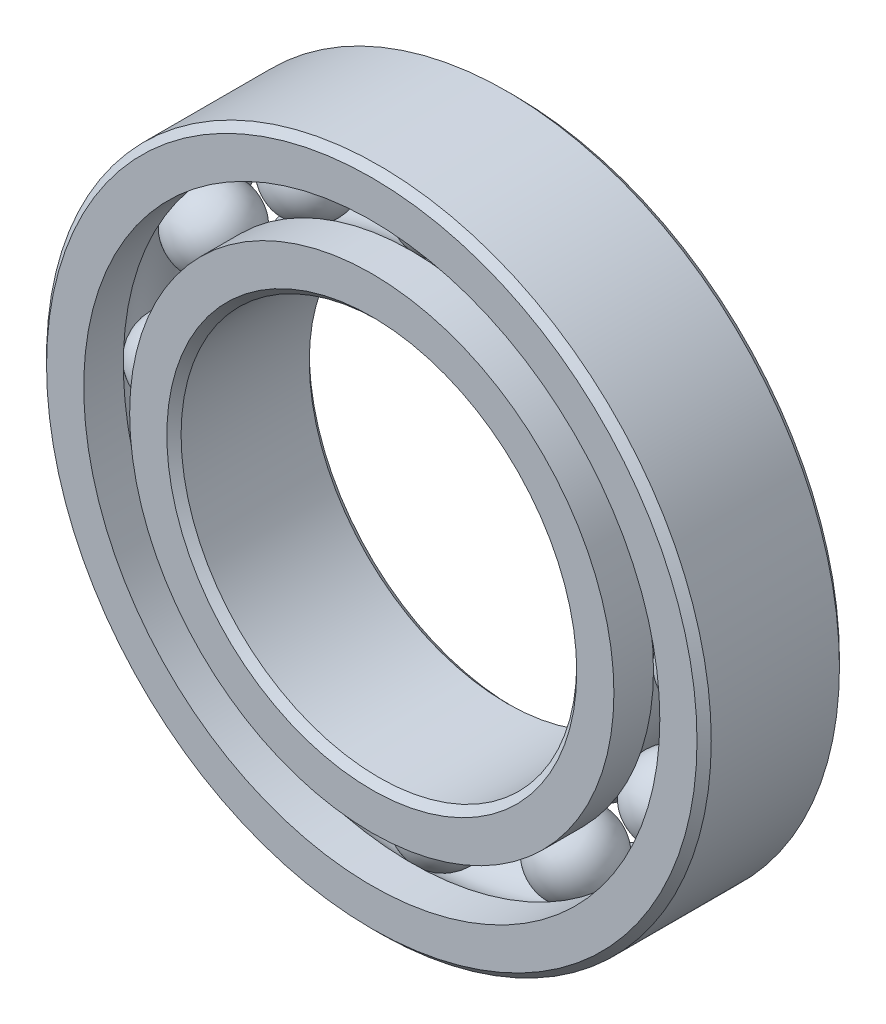
ISO-10303-21;
HEADER;
FILE_DESCRIPTION(('STEP AP214'),'2;1');
FILE_NAME('part.step','',(''),(''),'','','');
FILE_SCHEMA(('AUTOMOTIVE_DESIGN { 1 0 10303 214 1 1 1 1 }'));
ENDSEC;
DATA;
#1=APPLICATION_CONTEXT('core data for automotive mechanical design processes');
#2=APPLICATION_PROTOCOL_DEFINITION('international standard','automotive_design',2000,#1);
#3=PRODUCT_CONTEXT('',#1,'mechanical');
#4=PRODUCT('Part','Part','',(#3));
#5=PRODUCT_RELATED_PRODUCT_CATEGORY('part','',(#4));
#6=PRODUCT_DEFINITION_FORMATION('','',#4);
#7=PRODUCT_DEFINITION_CONTEXT('part definition',#1,'design');
#8=PRODUCT_DEFINITION('design','',#6,#7);
#9=PRODUCT_DEFINITION_SHAPE('','',#8);
#10=(LENGTH_UNIT() NAMED_UNIT(*) SI_UNIT(.MILLI.,.METRE.));
#11=(NAMED_UNIT(*) PLANE_ANGLE_UNIT() SI_UNIT($,.RADIAN.));
#12=(NAMED_UNIT(*) SI_UNIT($,.STERADIAN.) SOLID_ANGLE_UNIT());
#13=UNCERTAINTY_MEASURE_WITH_UNIT(LENGTH_MEASURE(1.E-05),#10,'distance_accuracy_value','');
#14=(GEOMETRIC_REPRESENTATION_CONTEXT(3) GLOBAL_UNCERTAINTY_ASSIGNED_CONTEXT((#13)) GLOBAL_UNIT_ASSIGNED_CONTEXT((#10,
#11,#12)) REPRESENTATION_CONTEXT('',''));
#15=CARTESIAN_POINT('',(0.,0.,0.));
#16=DIRECTION('',(0.,0.,1.));
#17=DIRECTION('',(1.,0.,0.));
#18=AXIS2_PLACEMENT_3D('',#15,#16,#17);
#19=CARTESIAN_POINT('',(-8.37499999999982,14.5059255133895,0.));
#20=DIRECTION('',(0.,0.,1.));
#21=DIRECTION('',(-0.499999999999989,0.866025403784445,0.));
#22=AXIS2_PLACEMENT_3D('',#19,#20,#21);
#23=SPHERICAL_SURFACE('',#22,2.47064641510867);
#24=CARTESIAN_POINT('',(-8.37499999999982,14.5059255133895,2.47064641510867));
#25=VERTEX_POINT('',#24);
#26=VERTEX_LOOP('',#25);
#27=FACE_BOUND('',#26,.T.);
#28=ADVANCED_FACE('F39',(#27),#23,.T.);
#29=CLOSED_SHELL('',(#28));
#30=MANIFOLD_SOLID_BREP('B2',#29);
#31=CARTESIAN_POINT('',(-14.5059255133893,8.37500000000017,0.));
#32=DIRECTION('',(0.,0.,1.));
#33=DIRECTION('',(-0.866025403784433,0.50000000000001,0.));
#34=AXIS2_PLACEMENT_3D('',#31,#32,#33);
#35=SPHERICAL_SURFACE('',#34,2.47064641510867);
#36=CARTESIAN_POINT('',(-14.5059255133893,8.37500000000017,2.47064641510867));
#37=VERTEX_POINT('',#36);
#38=VERTEX_LOOP('',#37);
#39=FACE_BOUND('',#38,.T.);
#40=ADVANCED_FACE('F59',(#39),#35,.T.);
#41=CLOSED_SHELL('',(#40));
#42=MANIFOLD_SOLID_BREP('B6',#41);
#43=CARTESIAN_POINT('',(-16.75,1.75446937276867E-13,0.));
#44=DIRECTION('',(0.,0.,1.));
#45=DIRECTION('',(-1.,0.,0.));
#46=AXIS2_PLACEMENT_3D('',#43,#44,#45);
#47=SPHERICAL_SURFACE('',#46,2.47064641510867);
#48=CARTESIAN_POINT('',(-16.75,1.75446937276867E-13,2.47064641510867));
#49=VERTEX_POINT('',#48);
#50=VERTEX_LOOP('',#49);
#51=FACE_BOUND('',#50,.T.);
#52=ADVANCED_FACE('F79',(#51),#47,.T.);
#53=CLOSED_SHELL('',(#52));
#54=MANIFOLD_SOLID_BREP('B35',#53);
#55=CARTESIAN_POINT('',(-14.5059255133894,-8.37499999999986,0.));
#56=DIRECTION('',(0.,0.,1.));
#57=DIRECTION('',(-0.866025403784443,-0.499999999999992,0.));
#58=AXIS2_PLACEMENT_3D('',#55,#56,#57);
#59=SPHERICAL_SURFACE('',#58,2.47064641510867);
#60=CARTESIAN_POINT('',(-14.5059255133894,-8.37499999999986,2.47064641510867));
#61=VERTEX_POINT('',#60);
#62=VERTEX_LOOP('',#61);
#63=FACE_BOUND('',#62,.T.);
#64=ADVANCED_FACE('F99',(#63),#59,.T.);
#65=CLOSED_SHELL('',(#64));
#66=MANIFOLD_SOLID_BREP('B55',#65);
#67=CARTESIAN_POINT('',(-8.37500000000012,-14.5059255133893,0.));
#68=DIRECTION('',(0.,0.,1.));
#69=DIRECTION('',(-0.500000000000007,-0.866025403784435,0.));
#70=AXIS2_PLACEMENT_3D('',#67,#68,#69);
#71=SPHERICAL_SURFACE('',#70,2.47064641510867);
#72=CARTESIAN_POINT('',(-8.37500000000012,-14.5059255133893,2.47064641510867));
#73=VERTEX_POINT('',#72);
#74=VERTEX_LOOP('',#73);
#75=FACE_BOUND('',#74,.T.);
#76=ADVANCED_FACE('F119',(#75),#71,.T.);
#77=CLOSED_SHELL('',(#76));
#78=MANIFOLD_SOLID_BREP('B75',#77);
#79=CARTESIAN_POINT('',(-1.16964624851245E-13,-16.75,0.));
#80=DIRECTION('',(0.,0.,1.));
#81=DIRECTION('',(0.,-1.,0.));
#82=AXIS2_PLACEMENT_3D('',#79,#80,#81);
#83=SPHERICAL_SURFACE('',#82,2.47064641510867);
#84=CARTESIAN_POINT('',(-1.16964624851245E-13,-16.75,2.47064641510867));
#85=VERTEX_POINT('',#84);
#86=VERTEX_LOOP('',#85);
#87=FACE_BOUND('',#86,.T.);
#88=ADVANCED_FACE('F139',(#87),#83,.T.);
#89=CLOSED_SHELL('',(#88));
#90=MANIFOLD_SOLID_BREP('B95',#89);
#91=CARTESIAN_POINT('',(8.37499999999991,-14.5059255133894,0.));
#92=DIRECTION('',(0.,0.,1.));
#93=DIRECTION('',(0.499999999999995,-0.866025403784442,0.));
#94=AXIS2_PLACEMENT_3D('',#91,#92,#93);
#95=SPHERICAL_SURFACE('',#94,2.47064641510867);
#96=CARTESIAN_POINT('',(8.37499999999991,-14.5059255133894,2.47064641510867));
#97=VERTEX_POINT('',#96);
#98=VERTEX_LOOP('',#97);
#99=FACE_BOUND('',#98,.T.);
#100=ADVANCED_FACE('F159',(#99),#95,.T.);
#101=CLOSED_SHELL('',(#100));
#102=MANIFOLD_SOLID_BREP('B115',#101);
#103=CARTESIAN_POINT('',(14.5059255133893,-8.37500000000007,0.));
#104=DIRECTION('',(0.,0.,1.));
#105=DIRECTION('',(0.866025403784436,-0.500000000000004,0.));
#106=AXIS2_PLACEMENT_3D('',#103,#104,#105);
#107=SPHERICAL_SURFACE('',#106,2.47064641510867);
#108=CARTESIAN_POINT('',(14.5059255133893,-8.37500000000007,2.47064641510867));
#109=VERTEX_POINT('',#108);
#110=VERTEX_LOOP('',#109);
#111=FACE_BOUND('',#110,.T.);
#112=ADVANCED_FACE('F179',(#111),#107,.T.);
#113=CLOSED_SHELL('',(#112));
#114=MANIFOLD_SOLID_BREP('B135',#113);
#115=CARTESIAN_POINT('',(16.75,0.,0.));
#116=DIRECTION('',(0.,0.,1.));
#117=DIRECTION('',(1.,0.,0.));
#118=AXIS2_PLACEMENT_3D('',#115,#116,#117);
#119=SPHERICAL_SURFACE('',#118,2.47064641510867);
#120=CARTESIAN_POINT('',(16.75,0.,2.47064641510867));
#121=VERTEX_POINT('',#120);
#122=VERTEX_LOOP('',#121);
#123=FACE_BOUND('',#122,.T.);
#124=ADVANCED_FACE('F199',(#123),#119,.T.);
#125=CLOSED_SHELL('',(#124));
#126=MANIFOLD_SOLID_BREP('B155',#125);
#127=CARTESIAN_POINT('',(14.5059255133894,8.37499999999997,0.));
#128=DIRECTION('',(0.,0.,1.));
#129=DIRECTION('',(0.86602540378444,0.499999999999998,0.));
#130=AXIS2_PLACEMENT_3D('',#127,#128,#129);
#131=SPHERICAL_SURFACE('',#130,2.47064641510867);
#132=CARTESIAN_POINT('',(14.5059255133894,8.37499999999997,2.47064641510867));
#133=VERTEX_POINT('',#132);
#134=VERTEX_LOOP('',#133);
#135=FACE_BOUND('',#134,.T.);
#136=ADVANCED_FACE('F219',(#135),#131,.T.);
#137=CLOSED_SHELL('',(#136));
#138=MANIFOLD_SOLID_BREP('B175',#137);
#139=CARTESIAN_POINT('',(8.37500000000002,14.5059255133893,0.));
#140=DIRECTION('',(0.,0.,1.));
#141=DIRECTION('',(0.500000000000001,0.866025403784438,0.));
#142=AXIS2_PLACEMENT_3D('',#139,#140,#141);
#143=SPHERICAL_SURFACE('',#142,2.47064641510867);
#144=CARTESIAN_POINT('',(8.37500000000002,14.5059255133893,2.47064641510867));
#145=VERTEX_POINT('',#144);
#146=VERTEX_LOOP('',#145);
#147=FACE_BOUND('',#146,.T.);
#148=ADVANCED_FACE('F239',(#147),#143,.T.);
#149=CLOSED_SHELL('',(#148));
#150=MANIFOLD_SOLID_BREP('B195',#149);
#151=CARTESIAN_POINT('',(0.,16.75,0.));
#152=DIRECTION('',(0.,0.,1.));
#153=DIRECTION('',(0.,1.,0.));
#154=AXIS2_PLACEMENT_3D('',#151,#152,#153);
#155=SPHERICAL_SURFACE('',#154,2.47064641510867);
#156=CARTESIAN_POINT('',(0.,16.75,2.47064641510867));
#157=VERTEX_POINT('',#156);
#158=VERTEX_LOOP('',#157);
#159=FACE_BOUND('',#158,.T.);
#160=ADVANCED_FACE('F261',(#159),#155,.T.);
#161=CLOSED_SHELL('',(#160));
#162=MANIFOLD_SOLID_BREP('B215',#161);
#163=CARTESIAN_POINT('',(0.,15.2994505494506,4.5));
#164=DIRECTION('',(0.,0.,-1.));
#165=DIRECTION('',(-1.,0.,0.));
#166=AXIS2_PLACEMENT_3D('',#163,#164,#165);
#167=PLANE('',#166);
#168=CARTESIAN_POINT('',(0.,0.,4.5));
#169=DIRECTION('',(0.,0.,1.));
#170=DIRECTION('',(1.,0.,0.));
#171=AXIS2_PLACEMENT_3D('',#168,#169,#170);
#172=CIRCLE('',#171,12.95);
#173=CARTESIAN_POINT('',(12.95,0.,4.5));
#174=VERTEX_POINT('',#173);
#175=EDGE_CURVE('E308',#174,#174,#172,.T.);
#176=ORIENTED_EDGE('',*,*,#175,.F.);
#177=EDGE_LOOP('',(#176));
#178=FACE_BOUND('',#177,.T.);
#179=CARTESIAN_POINT('',(0.,0.,4.5));
#180=DIRECTION('',(0.,0.,1.));
#181=DIRECTION('',(1.,0.,0.));
#182=AXIS2_PLACEMENT_3D('',#179,#180,#181);
#183=CIRCLE('',#182,15.2994505494506);
#184=CARTESIAN_POINT('',(15.2994505494506,0.,4.5));
#185=VERTEX_POINT('',#184);
#186=EDGE_CURVE('E260',#185,#185,#183,.T.);
#187=ORIENTED_EDGE('',*,*,#186,.T.);
#188=EDGE_LOOP('',(#187));
#189=FACE_BOUND('',#188,.T.);
#190=ADVANCED_FACE('F280',(#178,#189),#167,.F.);
#191=CARTESIAN_POINT('',(0.,0.,4.5));
#192=DIRECTION('',(0.,0.,1.));
#193=DIRECTION('',(1.,0.,0.));
#194=AXIS2_PLACEMENT_3D('',#191,#192,#193);
#195=CYLINDRICAL_SURFACE('',#194,15.2994505494506);
#196=ORIENTED_EDGE('',*,*,#186,.F.);
#197=EDGE_LOOP('',(#196));
#198=FACE_BOUND('',#197,.T.);
#199=CARTESIAN_POINT('',(0.,0.,2.));
#200=DIRECTION('',(0.,0.,1.));
#201=DIRECTION('',(1.,0.,0.));
#202=AXIS2_PLACEMENT_3D('',#199,#200,#201);
#203=CIRCLE('',#202,15.2994505494506);
#204=CARTESIAN_POINT('',(15.2994505494506,0.,2.));
#205=VERTEX_POINT('',#204);
#206=EDGE_CURVE('E286',#205,#205,#203,.T.);
#207=ORIENTED_EDGE('',*,*,#206,.T.);
#208=EDGE_LOOP('',(#207));
#209=FACE_BOUND('',#208,.T.);
#210=ADVANCED_FACE('F315',(#198,#209),#195,.T.);
#211=CARTESIAN_POINT('',(0.,0.,0.));
#212=DIRECTION('',(0.,0.,1.));
#213=DIRECTION('',(1.,0.,0.));
#214=AXIS2_PLACEMENT_3D('',#211,#212,#213);
#215=TOROIDAL_SURFACE('',#214,16.75,2.47064641510866);
#216=ORIENTED_EDGE('',*,*,#206,.F.);
#217=EDGE_LOOP('',(#216));
#218=FACE_BOUND('',#217,.T.);
#219=CARTESIAN_POINT('',(0.,0.,-2.));
#220=DIRECTION('',(0.,0.,1.));
#221=DIRECTION('',(1.,0.,0.));
#222=AXIS2_PLACEMENT_3D('',#219,#220,#221);
#223=CIRCLE('',#222,15.2994505494506);
#224=CARTESIAN_POINT('',(15.2994505494506,0.,-2.));
#225=VERTEX_POINT('',#224);
#226=EDGE_CURVE('E290',#225,#225,#223,.T.);
#227=ORIENTED_EDGE('',*,*,#226,.T.);
#228=EDGE_LOOP('',(#227));
#229=FACE_BOUND('',#228,.T.);
#230=ADVANCED_FACE('F319',(#218,#229),#215,.F.);
#231=CARTESIAN_POINT('',(0.,0.,4.5));
#232=DIRECTION('',(0.,0.,1.));
#233=DIRECTION('',(1.,0.,0.));
#234=AXIS2_PLACEMENT_3D('',#231,#232,#233);
#235=CYLINDRICAL_SURFACE('',#234,15.2994505494506);
#236=ORIENTED_EDGE('',*,*,#226,.F.);
#237=EDGE_LOOP('',(#236));
#238=FACE_BOUND('',#237,.T.);
#239=CARTESIAN_POINT('',(0.,0.,-4.5));
#240=DIRECTION('',(0.,0.,1.));
#241=DIRECTION('',(1.,0.,0.));
#242=AXIS2_PLACEMENT_3D('',#239,#240,#241);
#243=CIRCLE('',#242,15.2994505494506);
#244=CARTESIAN_POINT('',(15.2994505494506,0.,-4.5));
#245=VERTEX_POINT('',#244);
#246=EDGE_CURVE('E294',#245,#245,#243,.T.);
#247=ORIENTED_EDGE('',*,*,#246,.T.);
#248=EDGE_LOOP('',(#247));
#249=FACE_BOUND('',#248,.T.);
#250=ADVANCED_FACE('F324',(#238,#249),#235,.T.);
#251=CARTESIAN_POINT('',(0.,12.95,-4.5));
#252=DIRECTION('',(0.,0.,1.));
#253=DIRECTION('',(1.,0.,0.));
#254=AXIS2_PLACEMENT_3D('',#251,#252,#253);
#255=PLANE('',#254);
#256=ORIENTED_EDGE('',*,*,#246,.F.);
#257=EDGE_LOOP('',(#256));
#258=FACE_BOUND('',#257,.T.);
#259=CARTESIAN_POINT('',(0.,0.,-4.5));
#260=DIRECTION('',(0.,0.,1.));
#261=DIRECTION('',(1.,0.,0.));
#262=AXIS2_PLACEMENT_3D('',#259,#260,#261);
#263=CIRCLE('',#262,12.95);
#264=CARTESIAN_POINT('',(12.95,0.,-4.5));
#265=VERTEX_POINT('',#264);
#266=EDGE_CURVE('E299',#265,#265,#263,.T.);
#267=ORIENTED_EDGE('',*,*,#266,.T.);
#268=EDGE_LOOP('',(#267));
#269=FACE_BOUND('',#268,.T.);
#270=ADVANCED_FACE('F330',(#258,#269),#255,.F.);
#271=CARTESIAN_POINT('',(0.,0.,-4.05));
#272=DIRECTION('',(0.,0.,-1.));
#273=DIRECTION('',(-1.,0.,0.));
#274=AXIS2_PLACEMENT_3D('',#271,#272,#273);
#275=CONICAL_SURFACE('',#274,12.5,0.785398163397445);
#276=ORIENTED_EDGE('',*,*,#266,.F.);
#277=EDGE_LOOP('',(#276));
#278=FACE_BOUND('',#277,.T.);
#279=CARTESIAN_POINT('',(0.,0.,-4.05));
#280=DIRECTION('',(0.,0.,1.));
#281=DIRECTION('',(1.,0.,0.));
#282=AXIS2_PLACEMENT_3D('',#279,#280,#281);
#283=CIRCLE('',#282,12.5);
#284=CARTESIAN_POINT('',(12.5,0.,-4.05));
#285=VERTEX_POINT('',#284);
#286=EDGE_CURVE('E302',#285,#285,#283,.T.);
#287=ORIENTED_EDGE('',*,*,#286,.T.);
#288=EDGE_LOOP('',(#287));
#289=FACE_BOUND('',#288,.T.);
#290=ADVANCED_FACE('F334',(#278,#289),#275,.F.);
#291=CARTESIAN_POINT('',(0.,0.,4.5));
#292=DIRECTION('',(0.,0.,1.));
#293=DIRECTION('',(1.,0.,0.));
#294=AXIS2_PLACEMENT_3D('',#291,#292,#293);
#295=CYLINDRICAL_SURFACE('',#294,12.5);
#296=ORIENTED_EDGE('',*,*,#286,.F.);
#297=EDGE_LOOP('',(#296));
#298=FACE_BOUND('',#297,.T.);
#299=CARTESIAN_POINT('',(0.,0.,4.05));
#300=DIRECTION('',(0.,0.,1.));
#301=DIRECTION('',(1.,0.,0.));
#302=AXIS2_PLACEMENT_3D('',#299,#300,#301);
#303=CIRCLE('',#302,12.5);
#304=CARTESIAN_POINT('',(12.5,0.,4.05));
#305=VERTEX_POINT('',#304);
#306=EDGE_CURVE('E305',#305,#305,#303,.T.);
#307=ORIENTED_EDGE('',*,*,#306,.T.);
#308=EDGE_LOOP('',(#307));
#309=FACE_BOUND('',#308,.T.);
#310=ADVANCED_FACE('F338',(#298,#309),#295,.F.);
#311=CARTESIAN_POINT('',(0.,0.,4.5));
#312=DIRECTION('',(0.,0.,1.));
#313=DIRECTION('',(1.,0.,0.));
#314=AXIS2_PLACEMENT_3D('',#311,#312,#313);
#315=CONICAL_SURFACE('',#314,12.95,0.785398163397452);
#316=ORIENTED_EDGE('',*,*,#306,.F.);
#317=EDGE_LOOP('',(#316));
#318=FACE_BOUND('',#317,.T.);
#319=ORIENTED_EDGE('',*,*,#175,.T.);
#320=EDGE_LOOP('',(#319));
#321=FACE_BOUND('',#320,.T.);
#322=ADVANCED_FACE('F312',(#318,#321),#315,.F.);
#323=CLOSED_SHELL('',(#190,#210,#230,#250,#270,#290,#310,#322));
#324=MANIFOLD_SOLID_BREP('B235',#323);
#325=CARTESIAN_POINT('',(0.,0.,4.05));
#326=DIRECTION('',(0.,0.,-1.));
#327=DIRECTION('',(-1.,0.,0.));
#328=AXIS2_PLACEMENT_3D('',#325,#326,#327);
#329=CONICAL_SURFACE('',#328,21.,0.785398163397445);
#330=CARTESIAN_POINT('',(0.,0.,4.5));
#331=DIRECTION('',(0.,0.,1.));
#332=DIRECTION('',(1.,0.,0.));
#333=AXIS2_PLACEMENT_3D('',#330,#331,#332);
#334=CIRCLE('',#333,20.55);
#335=CARTESIAN_POINT('',(20.55,0.,4.5));
#336=VERTEX_POINT('',#335);
#337=EDGE_CURVE('E429',#336,#336,#334,.T.);
#338=ORIENTED_EDGE('',*,*,#337,.F.);
#339=EDGE_LOOP('',(#338));
#340=FACE_BOUND('',#339,.T.);
#341=CARTESIAN_POINT('',(0.,0.,4.05));
#342=DIRECTION('',(0.,0.,1.));
#343=DIRECTION('',(1.,0.,0.));
#344=AXIS2_PLACEMENT_3D('',#341,#342,#343);
#345=CIRCLE('',#344,21.);
#346=CARTESIAN_POINT('',(21.,0.,4.05));
#347=VERTEX_POINT('',#346);
#348=EDGE_CURVE('E279',#347,#347,#345,.T.);
#349=ORIENTED_EDGE('',*,*,#348,.T.);
#350=EDGE_LOOP('',(#349));
#351=FACE_BOUND('',#350,.T.);
#352=ADVANCED_FACE('F401',(#340,#351),#329,.T.);
#353=CARTESIAN_POINT('',(0.,0.,4.5));
#354=DIRECTION('',(0.,0.,1.));
#355=DIRECTION('',(1.,0.,0.));
#356=AXIS2_PLACEMENT_3D('',#353,#354,#355);
#357=CYLINDRICAL_SURFACE('',#356,21.);
#358=ORIENTED_EDGE('',*,*,#348,.F.);
#359=EDGE_LOOP('',(#358));
#360=FACE_BOUND('',#359,.T.);
#361=CARTESIAN_POINT('',(0.,0.,-4.05));
#362=DIRECTION('',(0.,0.,1.));
#363=DIRECTION('',(1.,0.,0.));
#364=AXIS2_PLACEMENT_3D('',#361,#362,#363);
#365=CIRCLE('',#364,21.);
#366=CARTESIAN_POINT('',(21.,0.,-4.05));
#367=VERTEX_POINT('',#366);
#368=EDGE_CURVE('E407',#367,#367,#365,.T.);
#369=ORIENTED_EDGE('',*,*,#368,.T.);
#370=EDGE_LOOP('',(#369));
#371=FACE_BOUND('',#370,.T.);
#372=ADVANCED_FACE('F436',(#360,#371),#357,.T.);
#373=CARTESIAN_POINT('',(0.,0.,-4.5));
#374=DIRECTION('',(0.,0.,1.));
#375=DIRECTION('',(1.,0.,0.));
#376=AXIS2_PLACEMENT_3D('',#373,#374,#375);
#377=CONICAL_SURFACE('',#376,20.55,0.785398163397445);
#378=ORIENTED_EDGE('',*,*,#368,.F.);
#379=EDGE_LOOP('',(#378));
#380=FACE_BOUND('',#379,.T.);
#381=CARTESIAN_POINT('',(0.,0.,-4.5));
#382=DIRECTION('',(0.,0.,1.));
#383=DIRECTION('',(1.,0.,0.));
#384=AXIS2_PLACEMENT_3D('',#381,#382,#383);
#385=CIRCLE('',#384,20.55);
#386=CARTESIAN_POINT('',(20.55,0.,-4.5));
#387=VERTEX_POINT('',#386);
#388=EDGE_CURVE('E411',#387,#387,#385,.T.);
#389=ORIENTED_EDGE('',*,*,#388,.T.);
#390=EDGE_LOOP('',(#389));
#391=FACE_BOUND('',#390,.T.);
#392=ADVANCED_FACE('F440',(#380,#391),#377,.T.);
#393=CARTESIAN_POINT('',(0.,20.55,-4.5));
#394=DIRECTION('',(0.,0.,1.));
#395=DIRECTION('',(1.,0.,0.));
#396=AXIS2_PLACEMENT_3D('',#393,#394,#395);
#397=PLANE('',#396);
#398=ORIENTED_EDGE('',*,*,#388,.F.);
#399=EDGE_LOOP('',(#398));
#400=FACE_BOUND('',#399,.T.);
#401=CARTESIAN_POINT('',(0.,0.,-4.5));
#402=DIRECTION('',(0.,0.,1.));
#403=DIRECTION('',(1.,0.,0.));
#404=AXIS2_PLACEMENT_3D('',#401,#402,#403);
#405=CIRCLE('',#404,18.2005494505495);
#406=CARTESIAN_POINT('',(18.2005494505495,0.,-4.5));
#407=VERTEX_POINT('',#406);
#408=EDGE_CURVE('E415',#407,#407,#405,.T.);
#409=ORIENTED_EDGE('',*,*,#408,.T.);
#410=EDGE_LOOP('',(#409));
#411=FACE_BOUND('',#410,.T.);
#412=ADVANCED_FACE('F445',(#400,#411),#397,.F.);
#413=CARTESIAN_POINT('',(0.,0.,4.5));
#414=DIRECTION('',(0.,0.,1.));
#415=DIRECTION('',(1.,0.,0.));
#416=AXIS2_PLACEMENT_3D('',#413,#414,#415);
#417=CYLINDRICAL_SURFACE('',#416,18.2005494505495);
#418=ORIENTED_EDGE('',*,*,#408,.F.);
#419=EDGE_LOOP('',(#418));
#420=FACE_BOUND('',#419,.T.);
#421=CARTESIAN_POINT('',(0.,0.,-2.));
#422=DIRECTION('',(0.,0.,1.));
#423=DIRECTION('',(1.,0.,0.));
#424=AXIS2_PLACEMENT_3D('',#421,#422,#423);
#425=CIRCLE('',#424,18.2005494505495);
#426=CARTESIAN_POINT('',(18.2005494505495,0.,-2.));
#427=VERTEX_POINT('',#426);
#428=EDGE_CURVE('E420',#427,#427,#425,.T.);
#429=ORIENTED_EDGE('',*,*,#428,.T.);
#430=EDGE_LOOP('',(#429));
#431=FACE_BOUND('',#430,.T.);
#432=ADVANCED_FACE('F451',(#420,#431),#417,.F.);
#433=CARTESIAN_POINT('',(0.,0.,0.));
#434=DIRECTION('',(0.,0.,1.));
#435=DIRECTION('',(1.,0.,0.));
#436=AXIS2_PLACEMENT_3D('',#433,#434,#435);
#437=TOROIDAL_SURFACE('',#436,16.75,2.47064641510867);
#438=ORIENTED_EDGE('',*,*,#428,.F.);
#439=EDGE_LOOP('',(#438));
#440=FACE_BOUND('',#439,.T.);
#441=CARTESIAN_POINT('',(0.,0.,2.));
#442=DIRECTION('',(0.,0.,1.));
#443=DIRECTION('',(1.,0.,0.));
#444=AXIS2_PLACEMENT_3D('',#441,#442,#443);
#445=CIRCLE('',#444,18.2005494505495);
#446=CARTESIAN_POINT('',(18.2005494505495,0.,2.));
#447=VERTEX_POINT('',#446);
#448=EDGE_CURVE('E423',#447,#447,#445,.T.);
#449=ORIENTED_EDGE('',*,*,#448,.T.);
#450=EDGE_LOOP('',(#449));
#451=FACE_BOUND('',#450,.T.);
#452=ADVANCED_FACE('F455',(#440,#451),#437,.F.);
#453=CARTESIAN_POINT('',(0.,0.,4.5));
#454=DIRECTION('',(0.,0.,1.));
#455=DIRECTION('',(1.,0.,0.));
#456=AXIS2_PLACEMENT_3D('',#453,#454,#455);
#457=CYLINDRICAL_SURFACE('',#456,18.2005494505495);
#458=ORIENTED_EDGE('',*,*,#448,.F.);
#459=EDGE_LOOP('',(#458));
#460=FACE_BOUND('',#459,.T.);
#461=CARTESIAN_POINT('',(0.,0.,4.5));
#462=DIRECTION('',(0.,0.,1.));
#463=DIRECTION('',(1.,0.,0.));
#464=AXIS2_PLACEMENT_3D('',#461,#462,#463);
#465=CIRCLE('',#464,18.2005494505495);
#466=CARTESIAN_POINT('',(18.2005494505495,0.,4.5));
#467=VERTEX_POINT('',#466);
#468=EDGE_CURVE('E426',#467,#467,#465,.T.);
#469=ORIENTED_EDGE('',*,*,#468,.T.);
#470=EDGE_LOOP('',(#469));
#471=FACE_BOUND('',#470,.T.);
#472=ADVANCED_FACE('F459',(#460,#471),#457,.F.);
#473=CARTESIAN_POINT('',(0.,20.55,4.5));
#474=DIRECTION('',(0.,0.,-1.));
#475=DIRECTION('',(-1.,0.,0.));
#476=AXIS2_PLACEMENT_3D('',#473,#474,#475);
#477=PLANE('',#476);
#478=ORIENTED_EDGE('',*,*,#468,.F.);
#479=EDGE_LOOP('',(#478));
#480=FACE_BOUND('',#479,.T.);
#481=ORIENTED_EDGE('',*,*,#337,.T.);
#482=EDGE_LOOP('',(#481));
#483=FACE_BOUND('',#482,.T.);
#484=ADVANCED_FACE('F433',(#480,#483),#477,.F.);
#485=CLOSED_SHELL('',(#352,#372,#392,#412,#432,#452,#472,#484));
#486=MANIFOLD_SOLID_BREP('B255',#485);
#487=ADVANCED_BREP_SHAPE_REPRESENTATION('',(#18,#30,#42,#54,#66,#78,#90,#102,#114,#126,#138,
#150,#162,#324,#486),#14);
#488=SHAPE_DEFINITION_REPRESENTATION(#9,#487);
ENDSEC;
END-ISO-10303-21;
